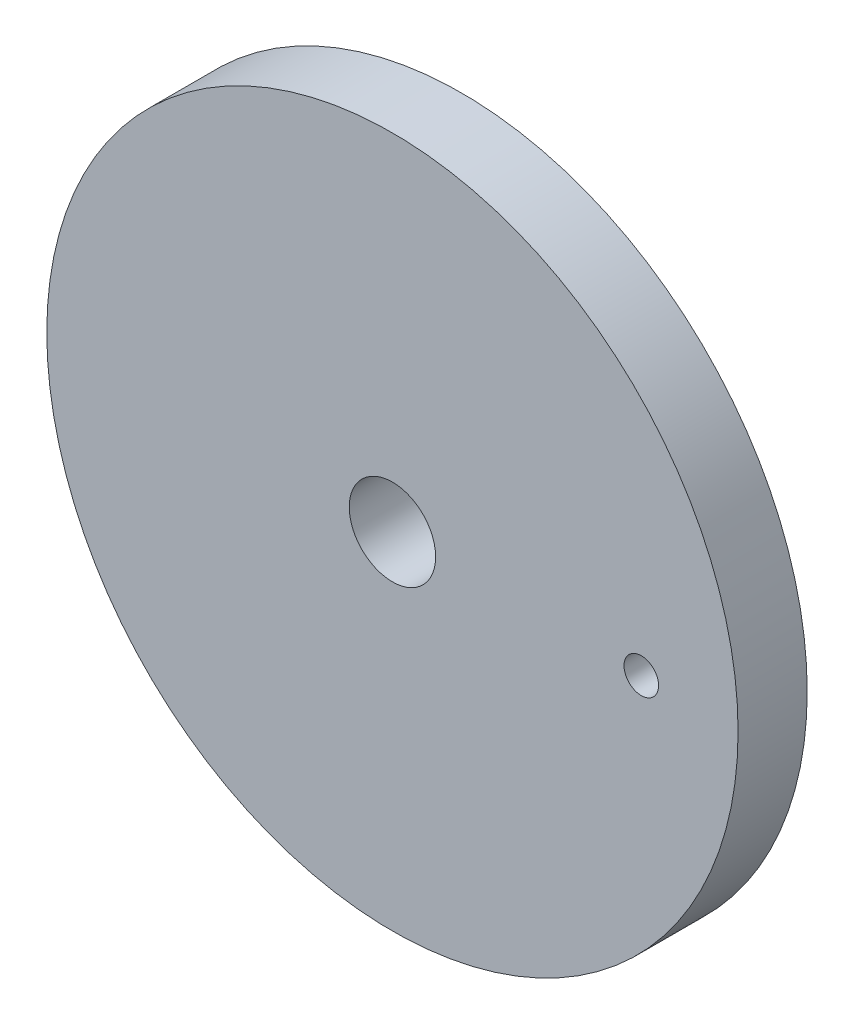
ISO-10303-21;
HEADER;
FILE_DESCRIPTION(('STEP AP214'),'2;1');
FILE_NAME('part.step','',(''),(''),'','','');
FILE_SCHEMA(('AUTOMOTIVE_DESIGN { 1 0 10303 214 1 1 1 1 }'));
ENDSEC;
DATA;
#1=APPLICATION_CONTEXT('core data for automotive mechanical design processes');
#2=APPLICATION_PROTOCOL_DEFINITION('international standard','automotive_design',2000,#1);
#3=PRODUCT_CONTEXT('',#1,'mechanical');
#4=PRODUCT('Part','Part','',(#3));
#5=PRODUCT_RELATED_PRODUCT_CATEGORY('part','',(#4));
#6=PRODUCT_DEFINITION_FORMATION('','',#4);
#7=PRODUCT_DEFINITION_CONTEXT('part definition',#1,'design');
#8=PRODUCT_DEFINITION('design','',#6,#7);
#9=PRODUCT_DEFINITION_SHAPE('','',#8);
#10=(LENGTH_UNIT() NAMED_UNIT(*) SI_UNIT(.MILLI.,.METRE.));
#11=(NAMED_UNIT(*) PLANE_ANGLE_UNIT() SI_UNIT($,.RADIAN.));
#12=(NAMED_UNIT(*) SI_UNIT($,.STERADIAN.) SOLID_ANGLE_UNIT());
#13=UNCERTAINTY_MEASURE_WITH_UNIT(LENGTH_MEASURE(1.E-05),#10,'distance_accuracy_value','');
#14=(GEOMETRIC_REPRESENTATION_CONTEXT(3) GLOBAL_UNCERTAINTY_ASSIGNED_CONTEXT((#13)) GLOBAL_UNIT_ASSIGNED_CONTEXT((#10,
#11,#12)) REPRESENTATION_CONTEXT('',''));
#15=CARTESIAN_POINT('',(0.,0.,0.));
#16=DIRECTION('',(0.,0.,1.));
#17=DIRECTION('',(1.,0.,0.));
#18=AXIS2_PLACEMENT_3D('',#15,#16,#17);
#19=CARTESIAN_POINT('',(0.,0.,10.));
#20=DIRECTION('',(0.,0.,1.));
#21=DIRECTION('',(1.,0.,0.));
#22=AXIS2_PLACEMENT_3D('',#19,#20,#21);
#23=PLANE('',#22);
#24=CARTESIAN_POINT('',(0.,0.,10.));
#25=DIRECTION('',(0.,0.,1.));
#26=DIRECTION('',(1.,0.,0.));
#27=AXIS2_PLACEMENT_3D('',#24,#25,#26);
#28=CIRCLE('',#27,6.25);
#29=CARTESIAN_POINT('',(6.25,0.,10.));
#30=VERTEX_POINT('',#29);
#31=EDGE_CURVE('E50',#30,#30,#28,.T.);
#32=ORIENTED_EDGE('',*,*,#31,.F.);
#33=EDGE_LOOP('',(#32));
#34=FACE_BOUND('',#33,.T.);
#35=CARTESIAN_POINT('',(0.,0.,10.));
#36=DIRECTION('',(0.,0.,1.));
#37=DIRECTION('',(1.,0.,0.));
#38=AXIS2_PLACEMENT_3D('',#35,#36,#37);
#39=CIRCLE('',#38,50.);
#40=CARTESIAN_POINT('',(50.,0.,10.));
#41=VERTEX_POINT('',#40);
#42=EDGE_CURVE('E10',#41,#41,#39,.T.);
#43=ORIENTED_EDGE('',*,*,#42,.T.);
#44=EDGE_LOOP('',(#43));
#45=FACE_BOUND('',#44,.T.);
#46=CARTESIAN_POINT('',(36.,0.,10.));
#47=DIRECTION('',(0.,0.,1.));
#48=DIRECTION('',(1.,0.,0.));
#49=AXIS2_PLACEMENT_3D('',#46,#47,#48);
#50=CIRCLE('',#49,2.5);
#51=CARTESIAN_POINT('',(38.5,0.,10.));
#52=VERTEX_POINT('',#51);
#53=EDGE_CURVE('E56',#52,#52,#50,.T.);
#54=ORIENTED_EDGE('',*,*,#53,.F.);
#55=EDGE_LOOP('',(#54));
#56=FACE_BOUND('',#55,.T.);
#57=ADVANCED_FACE('F37',(#34,#45,#56),#23,.T.);
#58=CARTESIAN_POINT('',(0.,0.,0.));
#59=DIRECTION('',(0.,0.,1.));
#60=DIRECTION('',(1.,0.,0.));
#61=AXIS2_PLACEMENT_3D('',#58,#59,#60);
#62=PLANE('',#61);
#63=CARTESIAN_POINT('',(0.,0.,0.));
#64=DIRECTION('',(0.,0.,1.));
#65=DIRECTION('',(1.,0.,0.));
#66=AXIS2_PLACEMENT_3D('',#63,#64,#65);
#67=CIRCLE('',#66,50.);
#68=CARTESIAN_POINT('',(50.,0.,0.));
#69=VERTEX_POINT('',#68);
#70=EDGE_CURVE('E41',#69,#69,#67,.T.);
#71=ORIENTED_EDGE('',*,*,#70,.F.);
#72=EDGE_LOOP('',(#71));
#73=FACE_BOUND('',#72,.T.);
#74=CARTESIAN_POINT('',(0.,0.,0.));
#75=DIRECTION('',(0.,0.,1.));
#76=DIRECTION('',(1.,0.,0.));
#77=AXIS2_PLACEMENT_3D('',#74,#75,#76);
#78=CIRCLE('',#77,6.25);
#79=CARTESIAN_POINT('',(6.25,0.,0.));
#80=VERTEX_POINT('',#79);
#81=EDGE_CURVE('E52',#80,#80,#78,.T.);
#82=ORIENTED_EDGE('',*,*,#81,.T.);
#83=EDGE_LOOP('',(#82));
#84=FACE_BOUND('',#83,.T.);
#85=CARTESIAN_POINT('',(36.,0.,0.));
#86=DIRECTION('',(0.,0.,1.));
#87=DIRECTION('',(1.,0.,0.));
#88=AXIS2_PLACEMENT_3D('',#85,#86,#87);
#89=CIRCLE('',#88,2.5);
#90=CARTESIAN_POINT('',(38.5,0.,0.));
#91=VERTEX_POINT('',#90);
#92=EDGE_CURVE('E60',#91,#91,#89,.T.);
#93=ORIENTED_EDGE('',*,*,#92,.T.);
#94=EDGE_LOOP('',(#93));
#95=FACE_BOUND('',#94,.T.);
#96=ADVANCED_FACE('F72',(#73,#84,#95),#62,.F.);
#97=CARTESIAN_POINT('',(0.,0.,10.));
#98=DIRECTION('',(0.,0.,-1.));
#99=DIRECTION('',(-1.,0.,0.));
#100=AXIS2_PLACEMENT_3D('',#97,#98,#99);
#101=CYLINDRICAL_SURFACE('',#100,50.);
#102=ORIENTED_EDGE('',*,*,#42,.F.);
#103=EDGE_LOOP('',(#102));
#104=FACE_BOUND('',#103,.T.);
#105=ORIENTED_EDGE('',*,*,#70,.T.);
#106=EDGE_LOOP('',(#105));
#107=FACE_BOUND('',#106,.T.);
#108=ADVANCED_FACE('F39',(#104,#107),#101,.T.);
#109=CARTESIAN_POINT('',(0.,0.,10.));
#110=DIRECTION('',(0.,0.,-1.));
#111=DIRECTION('',(-1.,0.,0.));
#112=AXIS2_PLACEMENT_3D('',#109,#110,#111);
#113=CYLINDRICAL_SURFACE('',#112,6.25);
#114=ORIENTED_EDGE('',*,*,#31,.T.);
#115=EDGE_LOOP('',(#114));
#116=FACE_BOUND('',#115,.T.);
#117=ORIENTED_EDGE('',*,*,#81,.F.);
#118=EDGE_LOOP('',(#117));
#119=FACE_BOUND('',#118,.T.);
#120=ADVANCED_FACE('F81',(#116,#119),#113,.F.);
#121=CARTESIAN_POINT('',(36.,0.,10.));
#122=DIRECTION('',(0.,0.,-1.));
#123=DIRECTION('',(-1.,0.,0.));
#124=AXIS2_PLACEMENT_3D('',#121,#122,#123);
#125=CYLINDRICAL_SURFACE('',#124,2.5);
#126=ORIENTED_EDGE('',*,*,#53,.T.);
#127=EDGE_LOOP('',(#126));
#128=FACE_BOUND('',#127,.T.);
#129=ORIENTED_EDGE('',*,*,#92,.F.);
#130=EDGE_LOOP('',(#129));
#131=FACE_BOUND('',#130,.T.);
#132=ADVANCED_FACE('F68',(#128,#131),#125,.F.);
#133=CLOSED_SHELL('',(#57,#96,#108,#120,#132));
#134=MANIFOLD_SOLID_BREP('B2',#133);
#135=ADVANCED_BREP_SHAPE_REPRESENTATION('',(#18,#134),#14);
#136=SHAPE_DEFINITION_REPRESENTATION(#9,#135);
ENDSEC;
END-ISO-10303-21;
